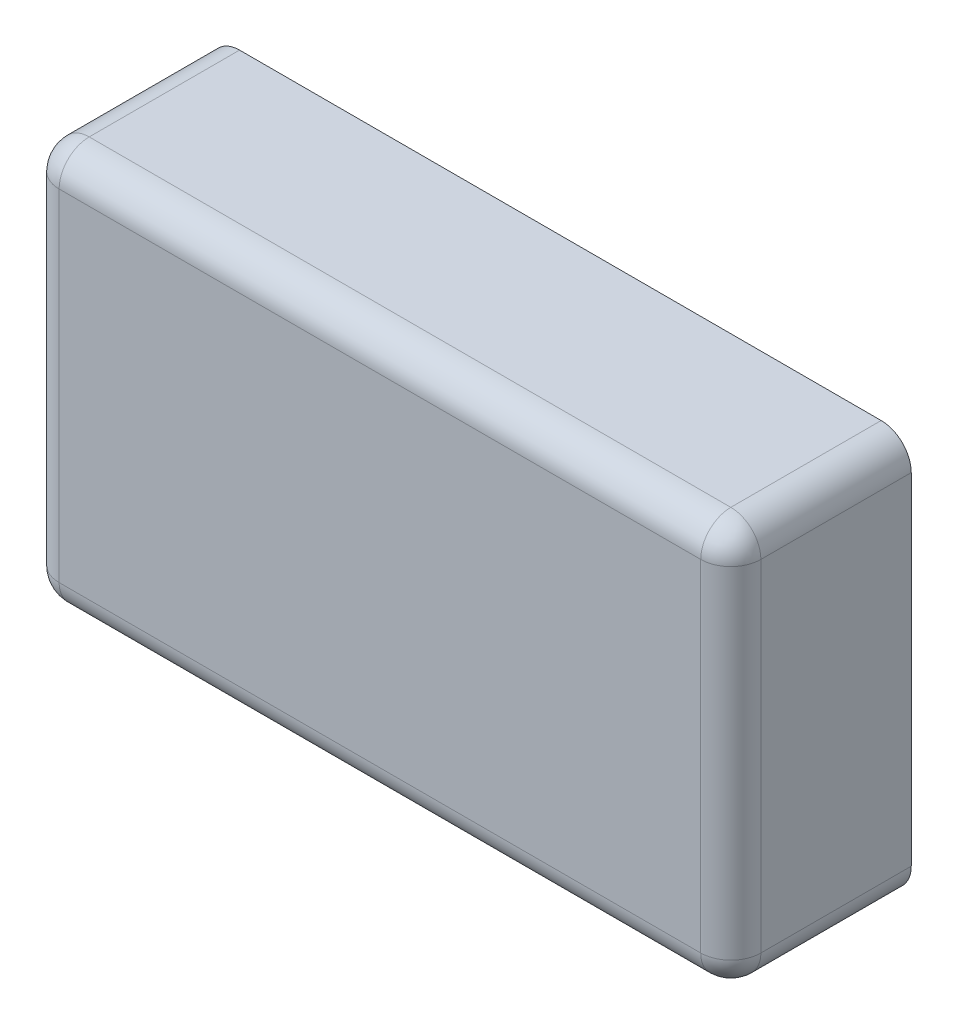
ISO-10303-21;
HEADER;
FILE_DESCRIPTION(('STEP AP214'),'2;1');
FILE_NAME('part.step','',(''),(''),'','','');
FILE_SCHEMA(('AUTOMOTIVE_DESIGN { 1 0 10303 214 1 1 1 1 }'));
ENDSEC;
DATA;
#1=APPLICATION_CONTEXT('core data for automotive mechanical design processes');
#2=APPLICATION_PROTOCOL_DEFINITION('international standard','automotive_design',2000,#1);
#3=PRODUCT_CONTEXT('',#1,'mechanical');
#4=PRODUCT('Part','Part','',(#3));
#5=PRODUCT_RELATED_PRODUCT_CATEGORY('part','',(#4));
#6=PRODUCT_DEFINITION_FORMATION('','',#4);
#7=PRODUCT_DEFINITION_CONTEXT('part definition',#1,'design');
#8=PRODUCT_DEFINITION('design','',#6,#7);
#9=PRODUCT_DEFINITION_SHAPE('','',#8);
#10=(LENGTH_UNIT() NAMED_UNIT(*) SI_UNIT(.MILLI.,.METRE.));
#11=(NAMED_UNIT(*) PLANE_ANGLE_UNIT() SI_UNIT($,.RADIAN.));
#12=(NAMED_UNIT(*) SI_UNIT($,.STERADIAN.) SOLID_ANGLE_UNIT());
#13=UNCERTAINTY_MEASURE_WITH_UNIT(LENGTH_MEASURE(1.E-05),#10,'distance_accuracy_value','');
#14=(GEOMETRIC_REPRESENTATION_CONTEXT(3) GLOBAL_UNCERTAINTY_ASSIGNED_CONTEXT((#13)) GLOBAL_UNIT_ASSIGNED_CONTEXT((#10,
#11,#12)) REPRESENTATION_CONTEXT('',''));
#15=CARTESIAN_POINT('',(0.,0.,0.));
#16=DIRECTION('',(0.,0.,1.));
#17=DIRECTION('',(1.,0.,0.));
#18=AXIS2_PLACEMENT_3D('',#15,#16,#17);
#19=CARTESIAN_POINT('',(-10.3402348947805,76.5000000000012,18.));
#20=DIRECTION('',(-1.,0.,0.));
#21=DIRECTION('',(0.,-1.,0.));
#22=AXIS2_PLACEMENT_3D('',#19,#20,#21);
#23=PLANE('',#22);
#24=DIRECTION('',(0.,1.,0.));
#25=VECTOR('',#24,1.);
#26=CARTESIAN_POINT('',(-10.3402348947805,76.5000000000012,0.));
#27=LINE('',#26,#25);
#28=CARTESIAN_POINT('',(-10.3402348947805,39.5000000000012,0.));
#29=VERTEX_POINT('',#28);
#30=CARTESIAN_POINT('',(-10.3402348947805,73.5000000000012,0.));
#31=VERTEX_POINT('',#30);
#32=EDGE_CURVE('E205',#29,#31,#27,.T.);
#33=ORIENTED_EDGE('',*,*,#32,.T.);
#34=DIRECTION('',(0.,0.,-1.));
#35=VECTOR('',#34,1.);
#36=CARTESIAN_POINT('',(-10.3402348947805,73.5000000000012,18.));
#37=LINE('',#36,#35);
#38=CARTESIAN_POINT('',(-10.3402348947805,73.5000000000012,15.));
#39=VERTEX_POINT('',#38);
#40=EDGE_CURVE('E57',#31,#39,#37,.F.);
#41=ORIENTED_EDGE('',*,*,#40,.T.);
#42=DIRECTION('',(0.,1.,0.));
#43=VECTOR('',#42,1.);
#44=CARTESIAN_POINT('',(-10.3402348947805,76.5000000000012,15.));
#45=LINE('',#44,#43);
#46=CARTESIAN_POINT('',(-10.3402348947805,39.5000000000012,15.));
#47=VERTEX_POINT('',#46);
#48=EDGE_CURVE('E62',#39,#47,#45,.F.);
#49=ORIENTED_EDGE('',*,*,#48,.T.);
#50=DIRECTION('',(0.,0.,-1.));
#51=VECTOR('',#50,1.);
#52=CARTESIAN_POINT('',(-10.3402348947805,39.5000000000012,18.));
#53=LINE('',#52,#51);
#54=EDGE_CURVE('E174',#47,#29,#53,.T.);
#55=ORIENTED_EDGE('',*,*,#54,.T.);
#56=EDGE_LOOP('',(#33,#41,#49,#55));
#57=FACE_BOUND('',#56,.T.);
#58=ADVANCED_FACE('F40',(#57),#23,.F.);
#59=CARTESIAN_POINT('',(-10.3402348947805,76.5000000000012,18.));
#60=DIRECTION('',(0.,-1.,0.));
#61=DIRECTION('',(0.,0.,-1.));
#62=AXIS2_PLACEMENT_3D('',#59,#60,#61);
#63=PLANE('',#62);
#64=DIRECTION('',(-1.,0.,0.));
#65=VECTOR('',#64,1.);
#66=CARTESIAN_POINT('',(-10.3402348947805,76.5000000000012,15.));
#67=LINE('',#66,#65);
#68=CARTESIAN_POINT('',(-77.3402348947805,76.5000000000012,15.));
#69=VERTEX_POINT('',#68);
#70=CARTESIAN_POINT('',(-13.3402348947805,76.5000000000012,15.));
#71=VERTEX_POINT('',#70);
#72=EDGE_CURVE('E170',#69,#71,#67,.F.);
#73=ORIENTED_EDGE('',*,*,#72,.T.);
#74=DIRECTION('',(0.,0.,-1.));
#75=VECTOR('',#74,1.);
#76=CARTESIAN_POINT('',(-13.3402348947805,76.5000000000012,18.));
#77=LINE('',#76,#75);
#78=CARTESIAN_POINT('',(-13.3402348947805,76.5000000000012,0.));
#79=VERTEX_POINT('',#78);
#80=EDGE_CURVE('E172',#71,#79,#77,.T.);
#81=ORIENTED_EDGE('',*,*,#80,.T.);
#82=DIRECTION('',(-1.,0.,0.));
#83=VECTOR('',#82,1.);
#84=CARTESIAN_POINT('',(-10.3402348947805,76.5000000000012,0.));
#85=LINE('',#84,#83);
#86=CARTESIAN_POINT('',(-77.3402348947805,76.5000000000012,0.));
#87=VERTEX_POINT('',#86);
#88=EDGE_CURVE('E207',#79,#87,#85,.T.);
#89=ORIENTED_EDGE('',*,*,#88,.T.);
#90=DIRECTION('',(0.,0.,-1.));
#91=VECTOR('',#90,1.);
#92=CARTESIAN_POINT('',(-77.3402348947805,76.5000000000012,18.));
#93=LINE('',#92,#91);
#94=EDGE_CURVE('E168',#87,#69,#93,.F.);
#95=ORIENTED_EDGE('',*,*,#94,.T.);
#96=EDGE_LOOP('',(#73,#81,#89,#95));
#97=FACE_BOUND('',#96,.T.);
#98=ADVANCED_FACE('F259',(#97),#63,.F.);
#99=CARTESIAN_POINT('',(-80.3402348947805,76.5000000000012,18.));
#100=DIRECTION('',(1.,0.,0.));
#101=DIRECTION('',(0.,0.,-1.));
#102=AXIS2_PLACEMENT_3D('',#99,#100,#101);
#103=PLANE('',#102);
#104=DIRECTION('',(0.,-1.,0.));
#105=VECTOR('',#104,1.);
#106=CARTESIAN_POINT('',(-80.3402348947805,76.5000000000012,15.));
#107=LINE('',#106,#105);
#108=CARTESIAN_POINT('',(-80.3402348947805,39.5000000000012,15.));
#109=VERTEX_POINT('',#108);
#110=CARTESIAN_POINT('',(-80.3402348947805,73.5000000000012,15.));
#111=VERTEX_POINT('',#110);
#112=EDGE_CURVE('E164',#109,#111,#107,.F.);
#113=ORIENTED_EDGE('',*,*,#112,.T.);
#114=DIRECTION('',(0.,0.,-1.));
#115=VECTOR('',#114,1.);
#116=CARTESIAN_POINT('',(-80.3402348947805,73.5000000000012,18.));
#117=LINE('',#116,#115);
#118=CARTESIAN_POINT('',(-80.3402348947805,73.5000000000012,0.));
#119=VERTEX_POINT('',#118);
#120=EDGE_CURVE('E166',#111,#119,#117,.T.);
#121=ORIENTED_EDGE('',*,*,#120,.T.);
#122=DIRECTION('',(0.,-1.,0.));
#123=VECTOR('',#122,1.);
#124=CARTESIAN_POINT('',(-80.3402348947805,76.5000000000012,0.));
#125=LINE('',#124,#123);
#126=CARTESIAN_POINT('',(-80.3402348947805,39.5000000000012,0.));
#127=VERTEX_POINT('',#126);
#128=EDGE_CURVE('E211',#119,#127,#125,.T.);
#129=ORIENTED_EDGE('',*,*,#128,.T.);
#130=DIRECTION('',(0.,0.,-1.));
#131=VECTOR('',#130,1.);
#132=CARTESIAN_POINT('',(-80.3402348947805,39.5000000000012,18.));
#133=LINE('',#132,#131);
#134=EDGE_CURVE('E162',#127,#109,#133,.F.);
#135=ORIENTED_EDGE('',*,*,#134,.T.);
#136=EDGE_LOOP('',(#113,#121,#129,#135));
#137=FACE_BOUND('',#136,.T.);
#138=ADVANCED_FACE('F264',(#137),#103,.F.);
#139=CARTESIAN_POINT('',(-10.3402348947805,36.5000000000012,18.));
#140=DIRECTION('',(0.,1.,0.));
#141=DIRECTION('',(-1.,0.,0.));
#142=AXIS2_PLACEMENT_3D('',#139,#140,#141);
#143=PLANE('',#142);
#144=DIRECTION('',(1.,0.,0.));
#145=VECTOR('',#144,1.);
#146=CARTESIAN_POINT('',(-10.3402348947805,36.5000000000012,15.));
#147=LINE('',#146,#145);
#148=CARTESIAN_POINT('',(-13.3402348947805,36.5000000000012,15.));
#149=VERTEX_POINT('',#148);
#150=CARTESIAN_POINT('',(-77.3402348947805,36.5000000000012,15.));
#151=VERTEX_POINT('',#150);
#152=EDGE_CURVE('E125',#149,#151,#147,.F.);
#153=ORIENTED_EDGE('',*,*,#152,.T.);
#154=DIRECTION('',(0.,0.,-1.));
#155=VECTOR('',#154,1.);
#156=CARTESIAN_POINT('',(-77.3402348947805,36.5000000000012,18.));
#157=LINE('',#156,#155);
#158=CARTESIAN_POINT('',(-77.3402348947805,36.5000000000012,0.));
#159=VERTEX_POINT('',#158);
#160=EDGE_CURVE('E160',#151,#159,#157,.T.);
#161=ORIENTED_EDGE('',*,*,#160,.T.);
#162=DIRECTION('',(1.,0.,0.));
#163=VECTOR('',#162,1.);
#164=CARTESIAN_POINT('',(-10.3402348947805,36.5000000000012,0.));
#165=LINE('',#164,#163);
#166=CARTESIAN_POINT('',(-13.3402348947805,36.5000000000012,0.));
#167=VERTEX_POINT('',#166);
#168=EDGE_CURVE('E147',#159,#167,#165,.T.);
#169=ORIENTED_EDGE('',*,*,#168,.T.);
#170=DIRECTION('',(0.,0.,-1.));
#171=VECTOR('',#170,1.);
#172=CARTESIAN_POINT('',(-13.3402348947805,36.5000000000012,18.));
#173=LINE('',#172,#171);
#174=EDGE_CURVE('E153',#167,#149,#173,.F.);
#175=ORIENTED_EDGE('',*,*,#174,.T.);
#176=EDGE_LOOP('',(#153,#161,#169,#175));
#177=FACE_BOUND('',#176,.T.);
#178=ADVANCED_FACE('F236',(#177),#143,.F.);
#179=CARTESIAN_POINT('',(0.,0.,18.));
#180=DIRECTION('',(0.,0.,-1.));
#181=DIRECTION('',(-1.,0.,0.));
#182=AXIS2_PLACEMENT_3D('',#179,#180,#181);
#183=PLANE('',#182);
#184=DIRECTION('',(0.,-1.,0.));
#185=VECTOR('',#184,1.);
#186=CARTESIAN_POINT('',(-77.3402348947805,0.,18.));
#187=LINE('',#186,#185);
#188=CARTESIAN_POINT('',(-77.3402348947805,73.5000000000012,18.));
#189=VERTEX_POINT('',#188);
#190=CARTESIAN_POINT('',(-77.3402348947805,39.5000000000012,18.));
#191=VERTEX_POINT('',#190);
#192=EDGE_CURVE('E151',#189,#191,#187,.T.);
#193=ORIENTED_EDGE('',*,*,#192,.T.);
#194=DIRECTION('',(1.,0.,0.));
#195=VECTOR('',#194,1.);
#196=CARTESIAN_POINT('',(0.,39.5000000000012,18.));
#197=LINE('',#196,#195);
#198=CARTESIAN_POINT('',(-13.3402348947805,39.5000000000012,18.));
#199=VERTEX_POINT('',#198);
#200=EDGE_CURVE('E123',#191,#199,#197,.T.);
#201=ORIENTED_EDGE('',*,*,#200,.T.);
#202=DIRECTION('',(0.,1.,0.));
#203=VECTOR('',#202,1.);
#204=CARTESIAN_POINT('',(-13.3402348947805,0.,18.));
#205=LINE('',#204,#203);
#206=CARTESIAN_POINT('',(-13.3402348947805,73.5000000000012,18.));
#207=VERTEX_POINT('',#206);
#208=EDGE_CURVE('E140',#199,#207,#205,.T.);
#209=ORIENTED_EDGE('',*,*,#208,.T.);
#210=DIRECTION('',(-1.,0.,0.));
#211=VECTOR('',#210,1.);
#212=CARTESIAN_POINT('',(0.,73.5000000000012,18.));
#213=LINE('',#212,#211);
#214=EDGE_CURVE('E146',#207,#189,#213,.T.);
#215=ORIENTED_EDGE('',*,*,#214,.T.);
#216=EDGE_LOOP('',(#193,#201,#209,#215));
#217=FACE_BOUND('',#216,.T.);
#218=ADVANCED_FACE('F149',(#217),#183,.F.);
#219=CARTESIAN_POINT('',(0.,0.,0.));
#220=DIRECTION('',(0.,0.,-1.));
#221=DIRECTION('',(-1.,0.,0.));
#222=AXIS2_PLACEMENT_3D('',#219,#220,#221);
#223=PLANE('',#222);
#224=ORIENTED_EDGE('',*,*,#88,.F.);
#225=CARTESIAN_POINT('',(-13.3402348947805,73.5000000000012,0.));
#226=DIRECTION('',(0.,0.,-1.));
#227=DIRECTION('',(-1.,0.,0.));
#228=AXIS2_PLACEMENT_3D('',#225,#226,#227);
#229=CIRCLE('',#228,3.);
#230=EDGE_CURVE('E11',#79,#31,#229,.T.);
#231=ORIENTED_EDGE('',*,*,#230,.T.);
#232=ORIENTED_EDGE('',*,*,#32,.F.);
#233=CARTESIAN_POINT('',(-13.3402348947805,39.5000000000012,0.));
#234=DIRECTION('',(0.,0.,-1.));
#235=DIRECTION('',(-1.,0.,0.));
#236=AXIS2_PLACEMENT_3D('',#233,#234,#235);
#237=CIRCLE('',#236,3.);
#238=EDGE_CURVE('E178',#29,#167,#237,.T.);
#239=ORIENTED_EDGE('',*,*,#238,.T.);
#240=ORIENTED_EDGE('',*,*,#168,.F.);
#241=CARTESIAN_POINT('',(-77.3402348947805,39.5000000000012,0.));
#242=DIRECTION('',(0.,0.,-1.));
#243=DIRECTION('',(-1.,0.,0.));
#244=AXIS2_PLACEMENT_3D('',#241,#242,#243);
#245=CIRCLE('',#244,3.);
#246=EDGE_CURVE('E180',#159,#127,#245,.T.);
#247=ORIENTED_EDGE('',*,*,#246,.T.);
#248=ORIENTED_EDGE('',*,*,#128,.F.);
#249=CARTESIAN_POINT('',(-77.3402348947805,73.5000000000012,0.));
#250=DIRECTION('',(0.,0.,-1.));
#251=DIRECTION('',(-1.,0.,0.));
#252=AXIS2_PLACEMENT_3D('',#249,#250,#251);
#253=CIRCLE('',#252,3.);
#254=EDGE_CURVE('E49',#119,#87,#253,.T.);
#255=ORIENTED_EDGE('',*,*,#254,.T.);
#256=EDGE_LOOP('',(#224,#231,#232,#239,#240,#247,#248,#255));
#257=FACE_BOUND('',#256,.T.);
#258=ADVANCED_FACE('F243',(#257),#223,.T.);
#259=CARTESIAN_POINT('',(-77.3402348947805,73.5000000000012,18.));
#260=DIRECTION('',(0.,0.,-1.));
#261=DIRECTION('',(-1.,0.,0.));
#262=AXIS2_PLACEMENT_3D('',#259,#260,#261);
#263=CYLINDRICAL_SURFACE('',#262,3.);
#264=ORIENTED_EDGE('',*,*,#254,.F.);
#265=ORIENTED_EDGE('',*,*,#120,.F.);
#266=CARTESIAN_POINT('',(-77.3402348947805,73.5000000000012,15.));
#267=DIRECTION('',(0.,0.,1.));
#268=DIRECTION('',(1.,0.,0.));
#269=AXIS2_PLACEMENT_3D('',#266,#267,#268);
#270=CIRCLE('',#269,3.);
#271=EDGE_CURVE('E44',#69,#111,#270,.T.);
#272=ORIENTED_EDGE('',*,*,#271,.F.);
#273=ORIENTED_EDGE('',*,*,#94,.F.);
#274=EDGE_LOOP('',(#264,#265,#272,#273));
#275=FACE_BOUND('',#274,.T.);
#276=ADVANCED_FACE('F42',(#275),#263,.T.);
#277=CARTESIAN_POINT('',(0.,73.5000000000012,15.));
#278=DIRECTION('',(-1.,0.,0.));
#279=DIRECTION('',(0.,0.,1.));
#280=AXIS2_PLACEMENT_3D('',#277,#278,#279);
#281=CYLINDRICAL_SURFACE('',#280,3.);
#282=CARTESIAN_POINT('',(-13.3402348947805,73.5000000000012,15.));
#283=DIRECTION('',(1.,0.,0.));
#284=DIRECTION('',(0.,0.,-1.));
#285=AXIS2_PLACEMENT_3D('',#282,#283,#284);
#286=CIRCLE('',#285,3.);
#287=EDGE_CURVE('E197',#71,#207,#286,.T.);
#288=ORIENTED_EDGE('',*,*,#287,.F.);
#289=ORIENTED_EDGE('',*,*,#72,.F.);
#290=CARTESIAN_POINT('',(-77.3402348947805,73.5000000000012,15.));
#291=DIRECTION('',(-1.,0.,0.));
#292=DIRECTION('',(0.,0.,1.));
#293=AXIS2_PLACEMENT_3D('',#290,#291,#292);
#294=CIRCLE('',#293,3.);
#295=EDGE_CURVE('E199',#189,#69,#294,.T.);
#296=ORIENTED_EDGE('',*,*,#295,.F.);
#297=ORIENTED_EDGE('',*,*,#214,.F.);
#298=EDGE_LOOP('',(#288,#289,#296,#297));
#299=FACE_BOUND('',#298,.T.);
#300=ADVANCED_FACE('F220',(#299),#281,.T.);
#301=CARTESIAN_POINT('',(-13.3402348947805,73.5000000000012,18.));
#302=DIRECTION('',(0.,0.,-1.));
#303=DIRECTION('',(-1.,0.,0.));
#304=AXIS2_PLACEMENT_3D('',#301,#302,#303);
#305=CYLINDRICAL_SURFACE('',#304,3.);
#306=ORIENTED_EDGE('',*,*,#230,.F.);
#307=ORIENTED_EDGE('',*,*,#80,.F.);
#308=CARTESIAN_POINT('',(-13.3402348947805,73.5000000000012,15.));
#309=DIRECTION('',(0.,0.,1.));
#310=DIRECTION('',(1.,0.,0.));
#311=AXIS2_PLACEMENT_3D('',#308,#309,#310);
#312=CIRCLE('',#311,3.);
#313=EDGE_CURVE('E194',#39,#71,#312,.T.);
#314=ORIENTED_EDGE('',*,*,#313,.F.);
#315=ORIENTED_EDGE('',*,*,#40,.F.);
#316=EDGE_LOOP('',(#306,#307,#314,#315));
#317=FACE_BOUND('',#316,.T.);
#318=ADVANCED_FACE('F247',(#317),#305,.T.);
#319=CARTESIAN_POINT('',(-77.3402348947805,73.5000000000012,15.));
#320=DIRECTION('',(0.,1.,0.));
#321=DIRECTION('',(0.,0.,1.));
#322=AXIS2_PLACEMENT_3D('',#319,#320,#321);
#323=SPHERICAL_SURFACE('',#322,3.);
#324=ORIENTED_EDGE('',*,*,#295,.T.);
#325=ORIENTED_EDGE('',*,*,#271,.T.);
#326=CARTESIAN_POINT('',(-77.3402348947805,73.5000000000012,15.));
#327=DIRECTION('',(0.,1.,0.));
#328=DIRECTION('',(0.,0.,1.));
#329=AXIS2_PLACEMENT_3D('',#326,#327,#328);
#330=CIRCLE('',#329,3.);
#331=EDGE_CURVE('E191',#189,#111,#330,.F.);
#332=ORIENTED_EDGE('',*,*,#331,.F.);
#333=EDGE_LOOP('',(#324,#325,#332));
#334=FACE_BOUND('',#333,.T.);
#335=ADVANCED_FACE('F221',(#334),#323,.T.);
#336=CARTESIAN_POINT('',(-13.3402348947805,73.5000000000012,15.));
#337=DIRECTION('',(0.,1.,0.));
#338=DIRECTION('',(0.,0.,1.));
#339=AXIS2_PLACEMENT_3D('',#336,#337,#338);
#340=SPHERICAL_SURFACE('',#339,3.);
#341=ORIENTED_EDGE('',*,*,#313,.T.);
#342=ORIENTED_EDGE('',*,*,#287,.T.);
#343=CARTESIAN_POINT('',(-13.3402348947805,73.5000000000012,15.));
#344=DIRECTION('',(0.,1.,0.));
#345=DIRECTION('',(0.,0.,1.));
#346=AXIS2_PLACEMENT_3D('',#343,#344,#345);
#347=CIRCLE('',#346,3.);
#348=EDGE_CURVE('E143',#39,#207,#347,.F.);
#349=ORIENTED_EDGE('',*,*,#348,.F.);
#350=EDGE_LOOP('',(#341,#342,#349));
#351=FACE_BOUND('',#350,.T.);
#352=ADVANCED_FACE('F249',(#351),#340,.T.);
#353=CARTESIAN_POINT('',(-77.3402348947805,39.5000000000012,18.));
#354=DIRECTION('',(0.,0.,-1.));
#355=DIRECTION('',(-1.,0.,0.));
#356=AXIS2_PLACEMENT_3D('',#353,#354,#355);
#357=CYLINDRICAL_SURFACE('',#356,3.);
#358=ORIENTED_EDGE('',*,*,#246,.F.);
#359=ORIENTED_EDGE('',*,*,#160,.F.);
#360=CARTESIAN_POINT('',(-77.3402348947805,39.5000000000012,15.));
#361=DIRECTION('',(0.,0.,1.));
#362=DIRECTION('',(1.,0.,0.));
#363=AXIS2_PLACEMENT_3D('',#360,#361,#362);
#364=CIRCLE('',#363,3.);
#365=EDGE_CURVE('E187',#109,#151,#364,.T.);
#366=ORIENTED_EDGE('',*,*,#365,.F.);
#367=ORIENTED_EDGE('',*,*,#134,.F.);
#368=EDGE_LOOP('',(#358,#359,#366,#367));
#369=FACE_BOUND('',#368,.T.);
#370=ADVANCED_FACE('F233',(#369),#357,.T.);
#371=CARTESIAN_POINT('',(-77.3402348947805,0.,15.));
#372=DIRECTION('',(0.,-1.,0.));
#373=DIRECTION('',(0.,0.,-1.));
#374=AXIS2_PLACEMENT_3D('',#371,#372,#373);
#375=CYLINDRICAL_SURFACE('',#374,3.);
#376=ORIENTED_EDGE('',*,*,#331,.T.);
#377=ORIENTED_EDGE('',*,*,#112,.F.);
#378=CARTESIAN_POINT('',(-77.3402348947805,39.5000000000012,15.));
#379=DIRECTION('',(0.,-1.,0.));
#380=DIRECTION('',(0.,0.,-1.));
#381=AXIS2_PLACEMENT_3D('',#378,#379,#380);
#382=CIRCLE('',#381,3.);
#383=EDGE_CURVE('E137',#191,#109,#382,.T.);
#384=ORIENTED_EDGE('',*,*,#383,.F.);
#385=ORIENTED_EDGE('',*,*,#192,.F.);
#386=EDGE_LOOP('',(#376,#377,#384,#385));
#387=FACE_BOUND('',#386,.T.);
#388=ADVANCED_FACE('F224',(#387),#375,.T.);
#389=CARTESIAN_POINT('',(-13.3402348947805,0.,15.));
#390=DIRECTION('',(0.,1.,0.));
#391=DIRECTION('',(-1.,0.,0.));
#392=AXIS2_PLACEMENT_3D('',#389,#390,#391);
#393=CYLINDRICAL_SURFACE('',#392,3.);
#394=ORIENTED_EDGE('',*,*,#348,.T.);
#395=ORIENTED_EDGE('',*,*,#208,.F.);
#396=CARTESIAN_POINT('',(-13.3402348947805,39.5000000000012,15.));
#397=DIRECTION('',(0.,-1.,0.));
#398=DIRECTION('',(0.,0.,-1.));
#399=AXIS2_PLACEMENT_3D('',#396,#397,#398);
#400=CIRCLE('',#399,3.);
#401=EDGE_CURVE('E131',#47,#199,#400,.T.);
#402=ORIENTED_EDGE('',*,*,#401,.F.);
#403=ORIENTED_EDGE('',*,*,#48,.F.);
#404=EDGE_LOOP('',(#394,#395,#402,#403));
#405=FACE_BOUND('',#404,.T.);
#406=ADVANCED_FACE('F141',(#405),#393,.T.);
#407=CARTESIAN_POINT('',(-13.3402348947805,39.5000000000012,18.));
#408=DIRECTION('',(0.,0.,-1.));
#409=DIRECTION('',(-1.,0.,0.));
#410=AXIS2_PLACEMENT_3D('',#407,#408,#409);
#411=CYLINDRICAL_SURFACE('',#410,3.);
#412=ORIENTED_EDGE('',*,*,#238,.F.);
#413=ORIENTED_EDGE('',*,*,#54,.F.);
#414=CARTESIAN_POINT('',(-13.3402348947805,39.5000000000012,15.));
#415=DIRECTION('',(0.,0.,1.));
#416=DIRECTION('',(1.,0.,0.));
#417=AXIS2_PLACEMENT_3D('',#414,#415,#416);
#418=CIRCLE('',#417,3.);
#419=EDGE_CURVE('E135',#149,#47,#418,.T.);
#420=ORIENTED_EDGE('',*,*,#419,.F.);
#421=ORIENTED_EDGE('',*,*,#174,.F.);
#422=EDGE_LOOP('',(#412,#413,#420,#421));
#423=FACE_BOUND('',#422,.T.);
#424=ADVANCED_FACE('F240',(#423),#411,.T.);
#425=CARTESIAN_POINT('',(-77.3402348947805,39.5000000000012,15.));
#426=DIRECTION('',(-1.,0.,0.));
#427=DIRECTION('',(0.,0.,1.));
#428=AXIS2_PLACEMENT_3D('',#425,#426,#427);
#429=SPHERICAL_SURFACE('',#428,3.);
#430=ORIENTED_EDGE('',*,*,#383,.T.);
#431=ORIENTED_EDGE('',*,*,#365,.T.);
#432=CARTESIAN_POINT('',(-77.3402348947805,39.5000000000012,15.));
#433=DIRECTION('',(-1.,0.,0.));
#434=DIRECTION('',(0.,0.,1.));
#435=AXIS2_PLACEMENT_3D('',#432,#433,#434);
#436=CIRCLE('',#435,3.);
#437=EDGE_CURVE('E128',#191,#151,#436,.F.);
#438=ORIENTED_EDGE('',*,*,#437,.F.);
#439=EDGE_LOOP('',(#430,#431,#438));
#440=FACE_BOUND('',#439,.T.);
#441=ADVANCED_FACE('F228',(#440),#429,.T.);
#442=CARTESIAN_POINT('',(-13.3402348947805,39.5000000000012,15.));
#443=DIRECTION('',(1.,0.,0.));
#444=DIRECTION('',(0.,0.,-1.));
#445=AXIS2_PLACEMENT_3D('',#442,#443,#444);
#446=SPHERICAL_SURFACE('',#445,3.);
#447=ORIENTED_EDGE('',*,*,#419,.T.);
#448=ORIENTED_EDGE('',*,*,#401,.T.);
#449=CARTESIAN_POINT('',(-13.3402348947805,39.5000000000012,15.));
#450=DIRECTION('',(1.,0.,0.));
#451=DIRECTION('',(0.,0.,-1.));
#452=AXIS2_PLACEMENT_3D('',#449,#450,#451);
#453=CIRCLE('',#452,3.);
#454=EDGE_CURVE('E119',#149,#199,#453,.F.);
#455=ORIENTED_EDGE('',*,*,#454,.F.);
#456=EDGE_LOOP('',(#447,#448,#455));
#457=FACE_BOUND('',#456,.T.);
#458=ADVANCED_FACE('F133',(#457),#446,.T.);
#459=CARTESIAN_POINT('',(0.,39.5000000000012,15.));
#460=DIRECTION('',(1.,0.,0.));
#461=DIRECTION('',(0.,1.,0.));
#462=AXIS2_PLACEMENT_3D('',#459,#460,#461);
#463=CYLINDRICAL_SURFACE('',#462,3.);
#464=ORIENTED_EDGE('',*,*,#437,.T.);
#465=ORIENTED_EDGE('',*,*,#152,.F.);
#466=ORIENTED_EDGE('',*,*,#454,.T.);
#467=ORIENTED_EDGE('',*,*,#200,.F.);
#468=EDGE_LOOP('',(#464,#465,#466,#467));
#469=FACE_BOUND('',#468,.T.);
#470=ADVANCED_FACE('F121',(#469),#463,.T.);
#471=CLOSED_SHELL('',(#58,#98,#138,#178,#218,#258,#276,#300,#318,#335,#352,#370,#388,#406,#424,
#441,#458,#470));
#472=MANIFOLD_SOLID_BREP('B2',#471);
#473=ADVANCED_BREP_SHAPE_REPRESENTATION('',(#18,#472),#14);
#474=SHAPE_DEFINITION_REPRESENTATION(#9,#473);
ENDSEC;
END-ISO-10303-21;
